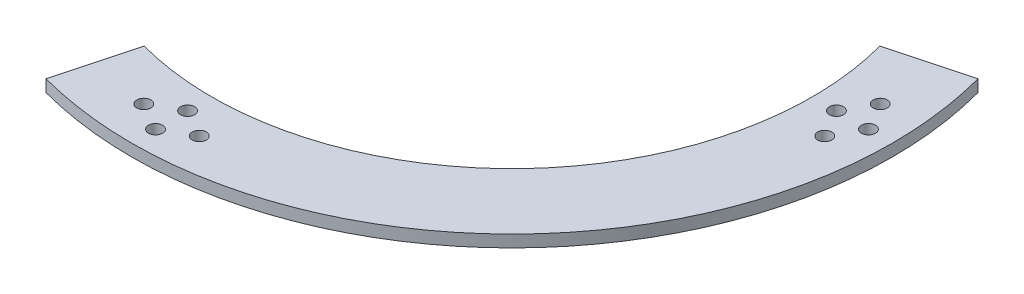
ISO-10303-21;
HEADER;
FILE_DESCRIPTION(('STEP AP214'),'2;1');
FILE_NAME('part.step','',(''),(''),'','','');
FILE_SCHEMA(('AUTOMOTIVE_DESIGN { 1 0 10303 214 1 1 1 1 }'));
ENDSEC;
DATA;
#1=APPLICATION_CONTEXT('core data for automotive mechanical design processes');
#2=APPLICATION_PROTOCOL_DEFINITION('international standard','automotive_design',2000,#1);
#3=PRODUCT_CONTEXT('',#1,'mechanical');
#4=PRODUCT('Part','Part','',(#3));
#5=PRODUCT_RELATED_PRODUCT_CATEGORY('part','',(#4));
#6=PRODUCT_DEFINITION_FORMATION('','',#4);
#7=PRODUCT_DEFINITION_CONTEXT('part definition',#1,'design');
#8=PRODUCT_DEFINITION('design','',#6,#7);
#9=PRODUCT_DEFINITION_SHAPE('','',#8);
#10=(LENGTH_UNIT() NAMED_UNIT(*) SI_UNIT(.MILLI.,.METRE.));
#11=(NAMED_UNIT(*) PLANE_ANGLE_UNIT() SI_UNIT($,.RADIAN.));
#12=(NAMED_UNIT(*) SI_UNIT($,.STERADIAN.) SOLID_ANGLE_UNIT());
#13=UNCERTAINTY_MEASURE_WITH_UNIT(LENGTH_MEASURE(1.E-05),#10,'distance_accuracy_value','');
#14=(GEOMETRIC_REPRESENTATION_CONTEXT(3) GLOBAL_UNCERTAINTY_ASSIGNED_CONTEXT((#13)) GLOBAL_UNIT_ASSIGNED_CONTEXT((#10,
#11,#12)) REPRESENTATION_CONTEXT('',''));
#15=CARTESIAN_POINT('',(0.,0.,0.));
#16=DIRECTION('',(0.,0.,1.));
#17=DIRECTION('',(1.,0.,0.));
#18=AXIS2_PLACEMENT_3D('',#15,#16,#17);
#19=CARTESIAN_POINT('',(0.,3.,0.));
#20=DIRECTION('',(0.,1.,0.));
#21=DIRECTION('',(0.,0.,1.));
#22=AXIS2_PLACEMENT_3D('',#19,#20,#21);
#23=PLANE('',#22);
#24=CARTESIAN_POINT('',(85.,3.,6.9282032302752));
#25=DIRECTION('',(0.,1.,0.));
#26=DIRECTION('',(0.,0.,1.));
#27=AXIS2_PLACEMENT_3D('',#24,#25,#26);
#28=CIRCLE('',#27,1.75);
#29=CARTESIAN_POINT('',(85.,3.,8.6782032302752));
#30=VERTEX_POINT('',#29);
#31=EDGE_CURVE('E178',#30,#30,#28,.T.);
#32=ORIENTED_EDGE('',*,*,#31,.F.);
#33=EDGE_LOOP('',(#32));
#34=FACE_BOUND('',#33,.T.);
#35=CARTESIAN_POINT('',(89.,3.,-3.2164119566945E-13));
#36=DIRECTION('',(0.,1.,0.));
#37=DIRECTION('',(0.,0.,1.));
#38=AXIS2_PLACEMENT_3D('',#35,#36,#37);
#39=CIRCLE('',#38,1.75);
#40=CARTESIAN_POINT('',(89.,3.,1.74999999999968));
#41=VERTEX_POINT('',#40);
#42=EDGE_CURVE('E162',#41,#41,#39,.T.);
#43=ORIENTED_EDGE('',*,*,#42,.F.);
#44=EDGE_LOOP('',(#43));
#45=FACE_BOUND('',#44,.T.);
#46=CARTESIAN_POINT('',(-6.9282032302755,3.,85.));
#47=DIRECTION('',(0.,1.,0.));
#48=DIRECTION('',(0.,0.,1.));
#49=AXIS2_PLACEMENT_3D('',#46,#47,#48);
#50=CIRCLE('',#49,1.75);
#51=CARTESIAN_POINT('',(-6.9282032302755,3.,86.75));
#52=VERTEX_POINT('',#51);
#53=EDGE_CURVE('E146',#52,#52,#50,.T.);
#54=ORIENTED_EDGE('',*,*,#53,.F.);
#55=EDGE_LOOP('',(#54));
#56=FACE_BOUND('',#55,.T.);
#57=CARTESIAN_POINT('',(0.,3.,89.));
#58=DIRECTION('',(0.,1.,0.));
#59=DIRECTION('',(0.,0.,1.));
#60=AXIS2_PLACEMENT_3D('',#57,#58,#59);
#61=CIRCLE('',#60,1.75);
#62=CARTESIAN_POINT('',(0.,3.,90.75));
#63=VERTEX_POINT('',#62);
#64=EDGE_CURVE('E116',#63,#63,#61,.T.);
#65=ORIENTED_EDGE('',*,*,#64,.F.);
#66=EDGE_LOOP('',(#65));
#67=FACE_BOUND('',#66,.T.);
#68=CARTESIAN_POINT('',(0.,3.,0.));
#69=DIRECTION('',(0.,1.,0.));
#70=DIRECTION('',(0.,0.,1.));
#71=AXIS2_PLACEMENT_3D('',#68,#69,#70);
#72=CIRCLE('',#71,95.);
#73=CARTESIAN_POINT('',(-24.5878092847395,3.,91.7629534974615));
#74=VERTEX_POINT('',#73);
#75=CARTESIAN_POINT('',(91.7629534974614,3.,-24.5878092847399));
#76=VERTEX_POINT('',#75);
#77=EDGE_CURVE('E96',#74,#76,#72,.T.);
#78=ORIENTED_EDGE('',*,*,#77,.T.);
#79=DIRECTION('',(-0.965925826289067,0.,0.258819045102525));
#80=VECTOR('',#79,1.);
#81=CARTESIAN_POINT('',(72.44443697168,3.,-19.4114283826894));
#82=LINE('',#81,#80);
#83=CARTESIAN_POINT('',(72.44443697168,3.,-19.4114283826894));
#84=VERTEX_POINT('',#83);
#85=EDGE_CURVE('E91',#76,#84,#82,.T.);
#86=ORIENTED_EDGE('',*,*,#85,.T.);
#87=CARTESIAN_POINT('',(0.,3.,0.));
#88=DIRECTION('',(0.,-1.,0.));
#89=DIRECTION('',(0.,0.,1.));
#90=AXIS2_PLACEMENT_3D('',#87,#88,#89);
#91=CIRCLE('',#90,75.);
#92=CARTESIAN_POINT('',(-19.4114283826891,3.,72.4444369716801));
#93=VERTEX_POINT('',#92);
#94=EDGE_CURVE('E94',#84,#93,#91,.T.);
#95=ORIENTED_EDGE('',*,*,#94,.T.);
#96=DIRECTION('',(-0.258819045102521,0.,0.965925826289068));
#97=VECTOR('',#96,1.);
#98=CARTESIAN_POINT('',(-19.4114283826891,3.,72.4444369716801));
#99=LINE('',#98,#97);
#100=EDGE_CURVE('E61',#93,#74,#99,.T.);
#101=ORIENTED_EDGE('',*,*,#100,.T.);
#102=EDGE_LOOP('',(#78,#86,#95,#101));
#103=FACE_BOUND('',#102,.T.);
#104=CARTESIAN_POINT('',(0.,3.,81.));
#105=DIRECTION('',(0.,1.,0.));
#106=DIRECTION('',(0.,0.,1.));
#107=AXIS2_PLACEMENT_3D('',#104,#105,#106);
#108=CIRCLE('',#107,1.75);
#109=CARTESIAN_POINT('',(0.,3.,82.75));
#110=VERTEX_POINT('',#109);
#111=EDGE_CURVE('E138',#110,#110,#108,.T.);
#112=ORIENTED_EDGE('',*,*,#111,.F.);
#113=EDGE_LOOP('',(#112));
#114=FACE_BOUND('',#113,.T.);
#115=CARTESIAN_POINT('',(6.92820323027552,3.,85.));
#116=DIRECTION('',(0.,1.,0.));
#117=DIRECTION('',(0.,0.,1.));
#118=AXIS2_PLACEMENT_3D('',#115,#116,#117);
#119=CIRCLE('',#118,1.75);
#120=CARTESIAN_POINT('',(6.92820323027552,3.,86.75));
#121=VERTEX_POINT('',#120);
#122=EDGE_CURVE('E154',#121,#121,#119,.T.);
#123=ORIENTED_EDGE('',*,*,#122,.F.);
#124=EDGE_LOOP('',(#123));
#125=FACE_BOUND('',#124,.T.);
#126=CARTESIAN_POINT('',(81.,3.,-2.92729627519387E-13));
#127=DIRECTION('',(0.,1.,0.));
#128=DIRECTION('',(0.,0.,1.));
#129=AXIS2_PLACEMENT_3D('',#126,#127,#128);
#130=CIRCLE('',#129,1.75);
#131=CARTESIAN_POINT('',(81.,3.,1.74999999999971));
#132=VERTEX_POINT('',#131);
#133=EDGE_CURVE('E170',#132,#132,#130,.T.);
#134=ORIENTED_EDGE('',*,*,#133,.F.);
#135=EDGE_LOOP('',(#134));
#136=FACE_BOUND('',#135,.T.);
#137=CARTESIAN_POINT('',(85.,3.,-6.92820323027581));
#138=DIRECTION('',(0.,1.,0.));
#139=DIRECTION('',(0.,0.,1.));
#140=AXIS2_PLACEMENT_3D('',#137,#138,#139);
#141=CIRCLE('',#140,1.75);
#142=CARTESIAN_POINT('',(85.,3.,-5.17820323027582));
#143=VERTEX_POINT('',#142);
#144=EDGE_CURVE('E186',#143,#143,#141,.T.);
#145=ORIENTED_EDGE('',*,*,#144,.F.);
#146=EDGE_LOOP('',(#145));
#147=FACE_BOUND('',#146,.T.);
#148=ADVANCED_FACE('F43',(#34,#45,#56,#67,#103,#114,#125,#136,#147),#23,.T.);
#149=CARTESIAN_POINT('',(0.,0.,0.));
#150=DIRECTION('',(0.,1.,0.));
#151=DIRECTION('',(0.,0.,1.));
#152=AXIS2_PLACEMENT_3D('',#149,#150,#151);
#153=PLANE('',#152);
#154=CARTESIAN_POINT('',(0.,0.,0.));
#155=DIRECTION('',(0.,1.,0.));
#156=DIRECTION('',(0.,0.,1.));
#157=AXIS2_PLACEMENT_3D('',#154,#155,#156);
#158=CIRCLE('',#157,95.);
#159=CARTESIAN_POINT('',(-24.5878092847395,0.,91.7629534974615));
#160=VERTEX_POINT('',#159);
#161=CARTESIAN_POINT('',(91.7629534974614,0.,-24.5878092847399));
#162=VERTEX_POINT('',#161);
#163=EDGE_CURVE('E112',#160,#162,#158,.T.);
#164=ORIENTED_EDGE('',*,*,#163,.F.);
#165=DIRECTION('',(-0.258819045102521,0.,0.965925826289068));
#166=VECTOR('',#165,1.);
#167=CARTESIAN_POINT('',(-19.4114283826891,0.,72.4444369716801));
#168=LINE('',#167,#166);
#169=CARTESIAN_POINT('',(-19.4114283826891,0.,72.4444369716801));
#170=VERTEX_POINT('',#169);
#171=EDGE_CURVE('E84',#170,#160,#168,.T.);
#172=ORIENTED_EDGE('',*,*,#171,.F.);
#173=CARTESIAN_POINT('',(0.,0.,0.));
#174=DIRECTION('',(0.,-1.,0.));
#175=DIRECTION('',(0.,0.,1.));
#176=AXIS2_PLACEMENT_3D('',#173,#174,#175);
#177=CIRCLE('',#176,75.);
#178=CARTESIAN_POINT('',(72.44443697168,0.,-19.4114283826894));
#179=VERTEX_POINT('',#178);
#180=EDGE_CURVE('E78',#179,#170,#177,.T.);
#181=ORIENTED_EDGE('',*,*,#180,.F.);
#182=DIRECTION('',(-0.965925826289067,0.,0.258819045102525));
#183=VECTOR('',#182,1.);
#184=CARTESIAN_POINT('',(72.44443697168,0.,-19.4114283826894));
#185=LINE('',#184,#183);
#186=EDGE_CURVE('E101',#162,#179,#185,.T.);
#187=ORIENTED_EDGE('',*,*,#186,.F.);
#188=EDGE_LOOP('',(#164,#172,#181,#187));
#189=FACE_BOUND('',#188,.T.);
#190=CARTESIAN_POINT('',(0.,0.,89.));
#191=DIRECTION('',(0.,1.,0.));
#192=DIRECTION('',(0.,0.,1.));
#193=AXIS2_PLACEMENT_3D('',#190,#191,#192);
#194=CIRCLE('',#193,1.75);
#195=CARTESIAN_POINT('',(0.,0.,90.75));
#196=VERTEX_POINT('',#195);
#197=EDGE_CURVE('E134',#196,#196,#194,.T.);
#198=ORIENTED_EDGE('',*,*,#197,.T.);
#199=EDGE_LOOP('',(#198));
#200=FACE_BOUND('',#199,.T.);
#201=CARTESIAN_POINT('',(0.,0.,81.));
#202=DIRECTION('',(0.,1.,0.));
#203=DIRECTION('',(0.,0.,1.));
#204=AXIS2_PLACEMENT_3D('',#201,#202,#203);
#205=CIRCLE('',#204,1.75);
#206=CARTESIAN_POINT('',(0.,0.,82.75));
#207=VERTEX_POINT('',#206);
#208=EDGE_CURVE('E142',#207,#207,#205,.T.);
#209=ORIENTED_EDGE('',*,*,#208,.T.);
#210=EDGE_LOOP('',(#209));
#211=FACE_BOUND('',#210,.T.);
#212=CARTESIAN_POINT('',(-6.9282032302755,0.,85.));
#213=DIRECTION('',(0.,1.,0.));
#214=DIRECTION('',(0.,0.,1.));
#215=AXIS2_PLACEMENT_3D('',#212,#213,#214);
#216=CIRCLE('',#215,1.75);
#217=CARTESIAN_POINT('',(-6.9282032302755,0.,86.75));
#218=VERTEX_POINT('',#217);
#219=EDGE_CURVE('E150',#218,#218,#216,.T.);
#220=ORIENTED_EDGE('',*,*,#219,.T.);
#221=EDGE_LOOP('',(#220));
#222=FACE_BOUND('',#221,.T.);
#223=CARTESIAN_POINT('',(6.92820323027552,0.,85.));
#224=DIRECTION('',(0.,1.,0.));
#225=DIRECTION('',(0.,0.,1.));
#226=AXIS2_PLACEMENT_3D('',#223,#224,#225);
#227=CIRCLE('',#226,1.75);
#228=CARTESIAN_POINT('',(6.92820323027552,0.,86.75));
#229=VERTEX_POINT('',#228);
#230=EDGE_CURVE('E158',#229,#229,#227,.T.);
#231=ORIENTED_EDGE('',*,*,#230,.T.);
#232=EDGE_LOOP('',(#231));
#233=FACE_BOUND('',#232,.T.);
#234=CARTESIAN_POINT('',(89.,0.,-3.2164119566945E-13));
#235=DIRECTION('',(0.,1.,0.));
#236=DIRECTION('',(0.,0.,1.));
#237=AXIS2_PLACEMENT_3D('',#234,#235,#236);
#238=CIRCLE('',#237,1.75);
#239=CARTESIAN_POINT('',(89.,0.,1.74999999999968));
#240=VERTEX_POINT('',#239);
#241=EDGE_CURVE('E166',#240,#240,#238,.T.);
#242=ORIENTED_EDGE('',*,*,#241,.T.);
#243=EDGE_LOOP('',(#242));
#244=FACE_BOUND('',#243,.T.);
#245=CARTESIAN_POINT('',(81.,0.,-2.92729627519387E-13));
#246=DIRECTION('',(0.,1.,0.));
#247=DIRECTION('',(0.,0.,1.));
#248=AXIS2_PLACEMENT_3D('',#245,#246,#247);
#249=CIRCLE('',#248,1.75);
#250=CARTESIAN_POINT('',(81.,0.,1.74999999999971));
#251=VERTEX_POINT('',#250);
#252=EDGE_CURVE('E174',#251,#251,#249,.T.);
#253=ORIENTED_EDGE('',*,*,#252,.T.);
#254=EDGE_LOOP('',(#253));
#255=FACE_BOUND('',#254,.T.);
#256=CARTESIAN_POINT('',(85.,0.,6.9282032302752));
#257=DIRECTION('',(0.,1.,0.));
#258=DIRECTION('',(0.,0.,1.));
#259=AXIS2_PLACEMENT_3D('',#256,#257,#258);
#260=CIRCLE('',#259,1.75);
#261=CARTESIAN_POINT('',(85.,0.,8.6782032302752));
#262=VERTEX_POINT('',#261);
#263=EDGE_CURVE('E182',#262,#262,#260,.T.);
#264=ORIENTED_EDGE('',*,*,#263,.T.);
#265=EDGE_LOOP('',(#264));
#266=FACE_BOUND('',#265,.T.);
#267=CARTESIAN_POINT('',(85.,0.,-6.92820323027581));
#268=DIRECTION('',(0.,1.,0.));
#269=DIRECTION('',(0.,0.,1.));
#270=AXIS2_PLACEMENT_3D('',#267,#268,#269);
#271=CIRCLE('',#270,1.75);
#272=CARTESIAN_POINT('',(85.,0.,-5.17820323027582));
#273=VERTEX_POINT('',#272);
#274=EDGE_CURVE('E190',#273,#273,#271,.T.);
#275=ORIENTED_EDGE('',*,*,#274,.T.);
#276=EDGE_LOOP('',(#275));
#277=FACE_BOUND('',#276,.T.);
#278=ADVANCED_FACE('F129',(#189,#200,#211,#222,#233,#244,#255,#266,#277),#153,.F.);
#279=CARTESIAN_POINT('',(0.,3.,0.));
#280=DIRECTION('',(0.,-1.,0.));
#281=DIRECTION('',(0.,0.,-1.));
#282=AXIS2_PLACEMENT_3D('',#279,#280,#281);
#283=CYLINDRICAL_SURFACE('',#282,95.);
#284=ORIENTED_EDGE('',*,*,#163,.T.);
#285=DIRECTION('',(0.,-1.,0.));
#286=VECTOR('',#285,1.);
#287=CARTESIAN_POINT('',(91.7629534974614,3.,-24.5878092847399));
#288=LINE('',#287,#286);
#289=EDGE_CURVE('E11',#76,#162,#288,.T.);
#290=ORIENTED_EDGE('',*,*,#289,.F.);
#291=ORIENTED_EDGE('',*,*,#77,.F.);
#292=DIRECTION('',(0.,-1.,0.));
#293=VECTOR('',#292,1.);
#294=CARTESIAN_POINT('',(-24.5878092847395,3.,91.7629534974615));
#295=LINE('',#294,#293);
#296=EDGE_CURVE('E108',#74,#160,#295,.T.);
#297=ORIENTED_EDGE('',*,*,#296,.T.);
#298=EDGE_LOOP('',(#284,#290,#291,#297));
#299=FACE_BOUND('',#298,.T.);
#300=ADVANCED_FACE('F45',(#299),#283,.T.);
#301=CARTESIAN_POINT('',(72.44443697168,3.,-19.4114283826894));
#302=DIRECTION('',(0.258819045102525,0.,0.965925826289067));
#303=DIRECTION('',(0.965925826289067,0.,-0.258819045102525));
#304=AXIS2_PLACEMENT_3D('',#301,#302,#303);
#305=PLANE('',#304);
#306=ORIENTED_EDGE('',*,*,#186,.T.);
#307=DIRECTION('',(0.,-1.,0.));
#308=VECTOR('',#307,1.);
#309=CARTESIAN_POINT('',(72.44443697168,3.,-19.4114283826894));
#310=LINE('',#309,#308);
#311=EDGE_CURVE('E53',#84,#179,#310,.T.);
#312=ORIENTED_EDGE('',*,*,#311,.F.);
#313=ORIENTED_EDGE('',*,*,#85,.F.);
#314=ORIENTED_EDGE('',*,*,#289,.T.);
#315=EDGE_LOOP('',(#306,#312,#313,#314));
#316=FACE_BOUND('',#315,.T.);
#317=ADVANCED_FACE('F100',(#316),#305,.F.);
#318=CARTESIAN_POINT('',(0.,3.,0.));
#319=DIRECTION('',(0.,-1.,0.));
#320=DIRECTION('',(0.,0.,-1.));
#321=AXIS2_PLACEMENT_3D('',#318,#319,#320);
#322=CYLINDRICAL_SURFACE('',#321,75.);
#323=ORIENTED_EDGE('',*,*,#180,.T.);
#324=DIRECTION('',(0.,-1.,0.));
#325=VECTOR('',#324,1.);
#326=CARTESIAN_POINT('',(-19.4114283826891,3.,72.4444369716801));
#327=LINE('',#326,#325);
#328=EDGE_CURVE('E103',#93,#170,#327,.T.);
#329=ORIENTED_EDGE('',*,*,#328,.F.);
#330=ORIENTED_EDGE('',*,*,#94,.F.);
#331=ORIENTED_EDGE('',*,*,#311,.T.);
#332=EDGE_LOOP('',(#323,#329,#330,#331));
#333=FACE_BOUND('',#332,.T.);
#334=ADVANCED_FACE('F104',(#333),#322,.F.);
#335=CARTESIAN_POINT('',(-19.4114283826891,3.,72.4444369716801));
#336=DIRECTION('',(0.965925826289068,0.,0.258819045102521));
#337=DIRECTION('',(0.258819045102521,0.,-0.965925826289068));
#338=AXIS2_PLACEMENT_3D('',#335,#336,#337);
#339=PLANE('',#338);
#340=ORIENTED_EDGE('',*,*,#171,.T.);
#341=ORIENTED_EDGE('',*,*,#296,.F.);
#342=ORIENTED_EDGE('',*,*,#100,.F.);
#343=ORIENTED_EDGE('',*,*,#328,.T.);
#344=EDGE_LOOP('',(#340,#341,#342,#343));
#345=FACE_BOUND('',#344,.T.);
#346=ADVANCED_FACE('F126',(#345),#339,.F.);
#347=CARTESIAN_POINT('',(0.,3.,89.));
#348=DIRECTION('',(0.,-1.,0.));
#349=DIRECTION('',(0.,0.,-1.));
#350=AXIS2_PLACEMENT_3D('',#347,#348,#349);
#351=CYLINDRICAL_SURFACE('',#350,1.75);
#352=ORIENTED_EDGE('',*,*,#64,.T.);
#353=EDGE_LOOP('',(#352));
#354=FACE_BOUND('',#353,.T.);
#355=ORIENTED_EDGE('',*,*,#197,.F.);
#356=EDGE_LOOP('',(#355));
#357=FACE_BOUND('',#356,.T.);
#358=ADVANCED_FACE('F211',(#354,#357),#351,.F.);
#359=CARTESIAN_POINT('',(0.,3.,81.));
#360=DIRECTION('',(0.,-1.,0.));
#361=DIRECTION('',(0.,0.,-1.));
#362=AXIS2_PLACEMENT_3D('',#359,#360,#361);
#363=CYLINDRICAL_SURFACE('',#362,1.75);
#364=ORIENTED_EDGE('',*,*,#111,.T.);
#365=EDGE_LOOP('',(#364));
#366=FACE_BOUND('',#365,.T.);
#367=ORIENTED_EDGE('',*,*,#208,.F.);
#368=EDGE_LOOP('',(#367));
#369=FACE_BOUND('',#368,.T.);
#370=ADVANCED_FACE('F265',(#366,#369),#363,.F.);
#371=CARTESIAN_POINT('',(-6.9282032302755,3.,85.));
#372=DIRECTION('',(0.,-1.,0.));
#373=DIRECTION('',(0.,0.,-1.));
#374=AXIS2_PLACEMENT_3D('',#371,#372,#373);
#375=CYLINDRICAL_SURFACE('',#374,1.75);
#376=ORIENTED_EDGE('',*,*,#53,.T.);
#377=EDGE_LOOP('',(#376));
#378=FACE_BOUND('',#377,.T.);
#379=ORIENTED_EDGE('',*,*,#219,.F.);
#380=EDGE_LOOP('',(#379));
#381=FACE_BOUND('',#380,.T.);
#382=ADVANCED_FACE('F274',(#378,#381),#375,.F.);
#383=CARTESIAN_POINT('',(6.92820323027552,3.,85.));
#384=DIRECTION('',(0.,-1.,0.));
#385=DIRECTION('',(0.,0.,-1.));
#386=AXIS2_PLACEMENT_3D('',#383,#384,#385);
#387=CYLINDRICAL_SURFACE('',#386,1.75);
#388=ORIENTED_EDGE('',*,*,#122,.T.);
#389=EDGE_LOOP('',(#388));
#390=FACE_BOUND('',#389,.T.);
#391=ORIENTED_EDGE('',*,*,#230,.F.);
#392=EDGE_LOOP('',(#391));
#393=FACE_BOUND('',#392,.T.);
#394=ADVANCED_FACE('F283',(#390,#393),#387,.F.);
#395=CARTESIAN_POINT('',(89.,3.,-3.2164119566945E-13));
#396=DIRECTION('',(0.,-1.,0.));
#397=DIRECTION('',(0.,0.,-1.));
#398=AXIS2_PLACEMENT_3D('',#395,#396,#397);
#399=CYLINDRICAL_SURFACE('',#398,1.75);
#400=ORIENTED_EDGE('',*,*,#42,.T.);
#401=EDGE_LOOP('',(#400));
#402=FACE_BOUND('',#401,.T.);
#403=ORIENTED_EDGE('',*,*,#241,.F.);
#404=EDGE_LOOP('',(#403));
#405=FACE_BOUND('',#404,.T.);
#406=ADVANCED_FACE('F293',(#402,#405),#399,.F.);
#407=CARTESIAN_POINT('',(81.,3.,-2.92729627519387E-13));
#408=DIRECTION('',(0.,-1.,0.));
#409=DIRECTION('',(0.,0.,-1.));
#410=AXIS2_PLACEMENT_3D('',#407,#408,#409);
#411=CYLINDRICAL_SURFACE('',#410,1.75);
#412=ORIENTED_EDGE('',*,*,#133,.T.);
#413=EDGE_LOOP('',(#412));
#414=FACE_BOUND('',#413,.T.);
#415=ORIENTED_EDGE('',*,*,#252,.F.);
#416=EDGE_LOOP('',(#415));
#417=FACE_BOUND('',#416,.T.);
#418=ADVANCED_FACE('F303',(#414,#417),#411,.F.);
#419=CARTESIAN_POINT('',(85.,3.,6.9282032302752));
#420=DIRECTION('',(0.,-1.,0.));
#421=DIRECTION('',(0.,0.,-1.));
#422=AXIS2_PLACEMENT_3D('',#419,#420,#421);
#423=CYLINDRICAL_SURFACE('',#422,1.75);
#424=ORIENTED_EDGE('',*,*,#31,.T.);
#425=EDGE_LOOP('',(#424));
#426=FACE_BOUND('',#425,.T.);
#427=ORIENTED_EDGE('',*,*,#263,.F.);
#428=EDGE_LOOP('',(#427));
#429=FACE_BOUND('',#428,.T.);
#430=ADVANCED_FACE('F313',(#426,#429),#423,.F.);
#431=CARTESIAN_POINT('',(85.,3.,-6.92820323027581));
#432=DIRECTION('',(0.,-1.,0.));
#433=DIRECTION('',(0.,0.,-1.));
#434=AXIS2_PLACEMENT_3D('',#431,#432,#433);
#435=CYLINDRICAL_SURFACE('',#434,1.75);
#436=ORIENTED_EDGE('',*,*,#144,.T.);
#437=EDGE_LOOP('',(#436));
#438=FACE_BOUND('',#437,.T.);
#439=ORIENTED_EDGE('',*,*,#274,.F.);
#440=EDGE_LOOP('',(#439));
#441=FACE_BOUND('',#440,.T.);
#442=ADVANCED_FACE('F198',(#438,#441),#435,.F.);
#443=CLOSED_SHELL('',(#148,#278,#300,#317,#334,#346,#358,#370,#382,#394,#406,#418,#430,#442));
#444=MANIFOLD_SOLID_BREP('B2',#443);
#445=ADVANCED_BREP_SHAPE_REPRESENTATION('',(#18,#444),#14);
#446=SHAPE_DEFINITION_REPRESENTATION(#9,#445);
ENDSEC;
END-ISO-10303-21;
